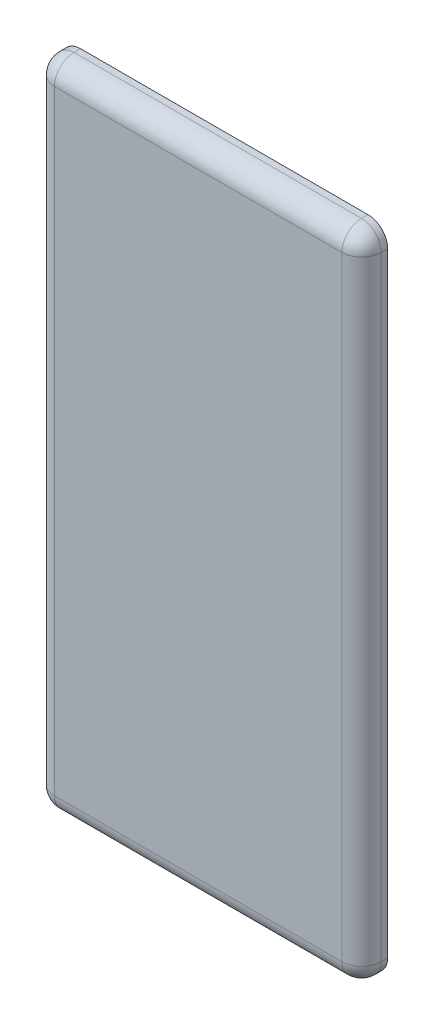
ISO-10303-21;
HEADER;
FILE_DESCRIPTION(('STEP AP214'),'2;1');
FILE_NAME('part.step','',(''),(''),'','','');
FILE_SCHEMA(('AUTOMOTIVE_DESIGN { 1 0 10303 214 1 1 1 1 }'));
ENDSEC;
DATA;
#1=APPLICATION_CONTEXT('core data for automotive mechanical design processes');
#2=APPLICATION_PROTOCOL_DEFINITION('international standard','automotive_design',2000,#1);
#3=PRODUCT_CONTEXT('',#1,'mechanical');
#4=PRODUCT('Part','Part','',(#3));
#5=PRODUCT_RELATED_PRODUCT_CATEGORY('part','',(#4));
#6=PRODUCT_DEFINITION_FORMATION('','',#4);
#7=PRODUCT_DEFINITION_CONTEXT('part definition',#1,'design');
#8=PRODUCT_DEFINITION('design','',#6,#7);
#9=PRODUCT_DEFINITION_SHAPE('','',#8);
#10=(LENGTH_UNIT() NAMED_UNIT(*) SI_UNIT(.MILLI.,.METRE.));
#11=(NAMED_UNIT(*) PLANE_ANGLE_UNIT() SI_UNIT($,.RADIAN.));
#12=(NAMED_UNIT(*) SI_UNIT($,.STERADIAN.) SOLID_ANGLE_UNIT());
#13=UNCERTAINTY_MEASURE_WITH_UNIT(LENGTH_MEASURE(1.E-05),#10,'distance_accuracy_value','');
#14=(GEOMETRIC_REPRESENTATION_CONTEXT(3) GLOBAL_UNCERTAINTY_ASSIGNED_CONTEXT((#13)) GLOBAL_UNIT_ASSIGNED_CONTEXT((#10,
#11,#12)) REPRESENTATION_CONTEXT('',''));
#15=CARTESIAN_POINT('',(0.,0.,0.));
#16=DIRECTION('',(0.,0.,1.));
#17=DIRECTION('',(1.,0.,0.));
#18=AXIS2_PLACEMENT_3D('',#15,#16,#17);
#19=CARTESIAN_POINT('',(25.,-50.,4.));
#20=DIRECTION('',(-1.,0.,0.));
#21=DIRECTION('',(0.,0.,1.));
#22=AXIS2_PLACEMENT_3D('',#19,#20,#21);
#23=PLANE('',#22);
#24=DIRECTION('',(0.,1.,0.));
#25=VECTOR('',#24,1.);
#26=CARTESIAN_POINT('',(25.,-50.,0.));
#27=LINE('',#26,#25);
#28=CARTESIAN_POINT('',(25.,-47.,0.));
#29=VERTEX_POINT('',#28);
#30=CARTESIAN_POINT('',(25.,47.,0.));
#31=VERTEX_POINT('',#30);
#32=EDGE_CURVE('E209',#29,#31,#27,.T.);
#33=ORIENTED_EDGE('',*,*,#32,.T.);
#34=DIRECTION('',(0.,0.,-1.));
#35=VECTOR('',#34,1.);
#36=CARTESIAN_POINT('',(25.,47.,4.));
#37=LINE('',#36,#35);
#38=CARTESIAN_POINT('',(25.,47.,1.));
#39=VERTEX_POINT('',#38);
#40=EDGE_CURVE('E200',#31,#39,#37,.F.);
#41=ORIENTED_EDGE('',*,*,#40,.T.);
#42=DIRECTION('',(0.,1.,0.));
#43=VECTOR('',#42,1.);
#44=CARTESIAN_POINT('',(25.,-50.,1.));
#45=LINE('',#44,#43);
#46=CARTESIAN_POINT('',(25.,-47.,1.));
#47=VERTEX_POINT('',#46);
#48=EDGE_CURVE('E173',#39,#47,#45,.F.);
#49=ORIENTED_EDGE('',*,*,#48,.T.);
#50=DIRECTION('',(0.,0.,-1.));
#51=VECTOR('',#50,1.);
#52=CARTESIAN_POINT('',(25.,-47.,4.));
#53=LINE('',#52,#51);
#54=EDGE_CURVE('E198',#47,#29,#53,.T.);
#55=ORIENTED_EDGE('',*,*,#54,.T.);
#56=EDGE_LOOP('',(#33,#41,#49,#55));
#57=FACE_BOUND('',#56,.T.);
#58=ADVANCED_FACE('F42',(#57),#23,.F.);
#59=CARTESIAN_POINT('',(-25.,50.,4.));
#60=DIRECTION('',(0.,-1.,0.));
#61=DIRECTION('',(0.,0.,-1.));
#62=AXIS2_PLACEMENT_3D('',#59,#60,#61);
#63=PLANE('',#62);
#64=DIRECTION('',(-1.,0.,0.));
#65=VECTOR('',#64,1.);
#66=CARTESIAN_POINT('',(-25.,50.,0.));
#67=LINE('',#66,#65);
#68=CARTESIAN_POINT('',(22.,50.,0.));
#69=VERTEX_POINT('',#68);
#70=CARTESIAN_POINT('',(-22.,50.,0.));
#71=VERTEX_POINT('',#70);
#72=EDGE_CURVE('E308',#69,#71,#67,.T.);
#73=ORIENTED_EDGE('',*,*,#72,.T.);
#74=DIRECTION('',(0.,0.,-1.));
#75=VECTOR('',#74,1.);
#76=CARTESIAN_POINT('',(-22.,50.,4.));
#77=LINE('',#76,#75);
#78=CARTESIAN_POINT('',(-22.,50.,1.));
#79=VERTEX_POINT('',#78);
#80=EDGE_CURVE('E196',#71,#79,#77,.F.);
#81=ORIENTED_EDGE('',*,*,#80,.T.);
#82=DIRECTION('',(-1.,0.,0.));
#83=VECTOR('',#82,1.);
#84=CARTESIAN_POINT('',(-25.,50.,1.));
#85=LINE('',#84,#83);
#86=CARTESIAN_POINT('',(22.,50.,1.));
#87=VERTEX_POINT('',#86);
#88=EDGE_CURVE('E171',#79,#87,#85,.F.);
#89=ORIENTED_EDGE('',*,*,#88,.T.);
#90=DIRECTION('',(0.,0.,-1.));
#91=VECTOR('',#90,1.);
#92=CARTESIAN_POINT('',(22.,50.,4.));
#93=LINE('',#92,#91);
#94=EDGE_CURVE('E65',#87,#69,#93,.T.);
#95=ORIENTED_EDGE('',*,*,#94,.T.);
#96=EDGE_LOOP('',(#73,#81,#89,#95));
#97=FACE_BOUND('',#96,.T.);
#98=ADVANCED_FACE('F236',(#97),#63,.F.);
#99=CARTESIAN_POINT('',(-25.,-50.,4.));
#100=DIRECTION('',(1.,0.,0.));
#101=DIRECTION('',(0.,0.,-1.));
#102=AXIS2_PLACEMENT_3D('',#99,#100,#101);
#103=PLANE('',#102);
#104=DIRECTION('',(0.,-1.,0.));
#105=VECTOR('',#104,1.);
#106=CARTESIAN_POINT('',(-25.,-50.,1.));
#107=LINE('',#106,#105);
#108=CARTESIAN_POINT('',(-25.,-47.,1.));
#109=VERTEX_POINT('',#108);
#110=CARTESIAN_POINT('',(-25.,47.,1.));
#111=VERTEX_POINT('',#110);
#112=EDGE_CURVE('E164',#109,#111,#107,.F.);
#113=ORIENTED_EDGE('',*,*,#112,.T.);
#114=DIRECTION('',(0.,0.,-1.));
#115=VECTOR('',#114,1.);
#116=CARTESIAN_POINT('',(-25.,47.,4.));
#117=LINE('',#116,#115);
#118=CARTESIAN_POINT('',(-25.,47.,0.));
#119=VERTEX_POINT('',#118);
#120=EDGE_CURVE('E186',#111,#119,#117,.T.);
#121=ORIENTED_EDGE('',*,*,#120,.T.);
#122=DIRECTION('',(0.,-1.,0.));
#123=VECTOR('',#122,1.);
#124=CARTESIAN_POINT('',(-25.,-50.,0.));
#125=LINE('',#124,#123);
#126=CARTESIAN_POINT('',(-25.,-47.,0.));
#127=VERTEX_POINT('',#126);
#128=EDGE_CURVE('E303',#119,#127,#125,.T.);
#129=ORIENTED_EDGE('',*,*,#128,.T.);
#130=DIRECTION('',(0.,0.,-1.));
#131=VECTOR('',#130,1.);
#132=CARTESIAN_POINT('',(-25.,-47.,4.));
#133=LINE('',#132,#131);
#134=EDGE_CURVE('E145',#127,#109,#133,.F.);
#135=ORIENTED_EDGE('',*,*,#134,.T.);
#136=EDGE_LOOP('',(#113,#121,#129,#135));
#137=FACE_BOUND('',#136,.T.);
#138=ADVANCED_FACE('F242',(#137),#103,.F.);
#139=CARTESIAN_POINT('',(-25.,-50.,4.));
#140=DIRECTION('',(0.,1.,0.));
#141=DIRECTION('',(0.,0.,1.));
#142=AXIS2_PLACEMENT_3D('',#139,#140,#141);
#143=PLANE('',#142);
#144=DIRECTION('',(1.,0.,0.));
#145=VECTOR('',#144,1.);
#146=CARTESIAN_POINT('',(-25.,-50.,0.));
#147=LINE('',#146,#145);
#148=CARTESIAN_POINT('',(-22.,-50.,0.));
#149=VERTEX_POINT('',#148);
#150=CARTESIAN_POINT('',(22.,-50.,0.));
#151=VERTEX_POINT('',#150);
#152=EDGE_CURVE('E157',#149,#151,#147,.T.);
#153=ORIENTED_EDGE('',*,*,#152,.T.);
#154=DIRECTION('',(0.,0.,-1.));
#155=VECTOR('',#154,1.);
#156=CARTESIAN_POINT('',(22.,-50.,4.));
#157=LINE('',#156,#155);
#158=CARTESIAN_POINT('',(22.,-50.,1.));
#159=VERTEX_POINT('',#158);
#160=EDGE_CURVE('E204',#151,#159,#157,.F.);
#161=ORIENTED_EDGE('',*,*,#160,.T.);
#162=DIRECTION('',(1.,0.,0.));
#163=VECTOR('',#162,1.);
#164=CARTESIAN_POINT('',(-25.,-50.,1.));
#165=LINE('',#164,#163);
#166=CARTESIAN_POINT('',(-22.,-50.,1.));
#167=VERTEX_POINT('',#166);
#168=EDGE_CURVE('E144',#159,#167,#165,.F.);
#169=ORIENTED_EDGE('',*,*,#168,.T.);
#170=DIRECTION('',(0.,0.,-1.));
#171=VECTOR('',#170,1.);
#172=CARTESIAN_POINT('',(-22.,-50.,4.));
#173=LINE('',#172,#171);
#174=EDGE_CURVE('E202',#167,#149,#173,.T.);
#175=ORIENTED_EDGE('',*,*,#174,.T.);
#176=EDGE_LOOP('',(#153,#161,#169,#175));
#177=FACE_BOUND('',#176,.T.);
#178=ADVANCED_FACE('F349',(#177),#143,.F.);
#179=CARTESIAN_POINT('',(0.,0.,4.));
#180=DIRECTION('',(0.,0.,-1.));
#181=DIRECTION('',(-1.,0.,0.));
#182=AXIS2_PLACEMENT_3D('',#179,#180,#181);
#183=PLANE('',#182);
#184=DIRECTION('',(0.,-1.,0.));
#185=VECTOR('',#184,1.);
#186=CARTESIAN_POINT('',(-22.,0.,4.));
#187=LINE('',#186,#185);
#188=CARTESIAN_POINT('',(-22.,47.,4.));
#189=VERTEX_POINT('',#188);
#190=CARTESIAN_POINT('',(-22.,-47.,4.));
#191=VERTEX_POINT('',#190);
#192=EDGE_CURVE('E162',#189,#191,#187,.T.);
#193=ORIENTED_EDGE('',*,*,#192,.T.);
#194=DIRECTION('',(1.,0.,0.));
#195=VECTOR('',#194,1.);
#196=CARTESIAN_POINT('',(0.,-47.,4.));
#197=LINE('',#196,#195);
#198=CARTESIAN_POINT('',(22.,-47.,4.));
#199=VERTEX_POINT('',#198);
#200=EDGE_CURVE('E141',#191,#199,#197,.T.);
#201=ORIENTED_EDGE('',*,*,#200,.T.);
#202=DIRECTION('',(0.,1.,0.));
#203=VECTOR('',#202,1.);
#204=CARTESIAN_POINT('',(22.,0.,4.));
#205=LINE('',#204,#203);
#206=CARTESIAN_POINT('',(22.,47.,4.));
#207=VERTEX_POINT('',#206);
#208=EDGE_CURVE('E150',#199,#207,#205,.T.);
#209=ORIENTED_EDGE('',*,*,#208,.T.);
#210=DIRECTION('',(-1.,0.,0.));
#211=VECTOR('',#210,1.);
#212=CARTESIAN_POINT('',(0.,47.,4.));
#213=LINE('',#212,#211);
#214=EDGE_CURVE('E156',#207,#189,#213,.T.);
#215=ORIENTED_EDGE('',*,*,#214,.T.);
#216=EDGE_LOOP('',(#193,#201,#209,#215));
#217=FACE_BOUND('',#216,.T.);
#218=ADVANCED_FACE('F160',(#217),#183,.F.);
#219=CARTESIAN_POINT('',(0.,0.,0.));
#220=DIRECTION('',(0.,0.,-1.));
#221=DIRECTION('',(-1.,0.,0.));
#222=AXIS2_PLACEMENT_3D('',#219,#220,#221);
#223=PLANE('',#222);
#224=CARTESIAN_POINT('',(0.,-25.,0.));
#225=DIRECTION('',(0.,0.,-1.));
#226=DIRECTION('',(-1.,0.,0.));
#227=AXIS2_PLACEMENT_3D('',#224,#225,#226);
#228=CIRCLE('',#227,4.75);
#229=CARTESIAN_POINT('',(-4.75000000000001,-25.,0.));
#230=VERTEX_POINT('',#229);
#231=EDGE_CURVE('E328',#230,#230,#228,.T.);
#232=ORIENTED_EDGE('',*,*,#231,.F.);
#233=EDGE_LOOP('',(#232));
#234=FACE_BOUND('',#233,.T.);
#235=CARTESIAN_POINT('',(0.,25.,0.));
#236=DIRECTION('',(0.,0.,-1.));
#237=DIRECTION('',(-1.,0.,0.));
#238=AXIS2_PLACEMENT_3D('',#235,#236,#237);
#239=CIRCLE('',#238,4.75);
#240=CARTESIAN_POINT('',(-4.75000000000001,25.,0.));
#241=VERTEX_POINT('',#240);
#242=EDGE_CURVE('E216',#241,#241,#239,.T.);
#243=ORIENTED_EDGE('',*,*,#242,.F.);
#244=EDGE_LOOP('',(#243));
#245=FACE_BOUND('',#244,.T.);
#246=ORIENTED_EDGE('',*,*,#128,.F.);
#247=CARTESIAN_POINT('',(-22.,47.,0.));
#248=DIRECTION('',(0.,0.,-1.));
#249=DIRECTION('',(-1.,0.,0.));
#250=AXIS2_PLACEMENT_3D('',#247,#248,#249);
#251=CIRCLE('',#250,3.);
#252=EDGE_CURVE('E58',#119,#71,#251,.T.);
#253=ORIENTED_EDGE('',*,*,#252,.T.);
#254=ORIENTED_EDGE('',*,*,#72,.F.);
#255=CARTESIAN_POINT('',(22.,47.,0.));
#256=DIRECTION('',(0.,0.,-1.));
#257=DIRECTION('',(-1.,0.,0.));
#258=AXIS2_PLACEMENT_3D('',#255,#256,#257);
#259=CIRCLE('',#258,3.);
#260=EDGE_CURVE('E192',#69,#31,#259,.T.);
#261=ORIENTED_EDGE('',*,*,#260,.T.);
#262=ORIENTED_EDGE('',*,*,#32,.F.);
#263=CARTESIAN_POINT('',(22.,-47.,0.));
#264=DIRECTION('',(0.,0.,-1.));
#265=DIRECTION('',(-1.,0.,0.));
#266=AXIS2_PLACEMENT_3D('',#263,#264,#265);
#267=CIRCLE('',#266,3.);
#268=EDGE_CURVE('E190',#29,#151,#267,.T.);
#269=ORIENTED_EDGE('',*,*,#268,.T.);
#270=ORIENTED_EDGE('',*,*,#152,.F.);
#271=CARTESIAN_POINT('',(-22.,-47.,0.));
#272=DIRECTION('',(0.,0.,-1.));
#273=DIRECTION('',(-1.,0.,0.));
#274=AXIS2_PLACEMENT_3D('',#271,#272,#273);
#275=CIRCLE('',#274,3.);
#276=EDGE_CURVE('E188',#149,#127,#275,.T.);
#277=ORIENTED_EDGE('',*,*,#276,.T.);
#278=EDGE_LOOP('',(#246,#253,#254,#261,#262,#269,#270,#277));
#279=FACE_BOUND('',#278,.T.);
#280=ADVANCED_FACE('F259',(#234,#245,#279),#223,.T.);
#281=CARTESIAN_POINT('',(0.,47.,1.));
#282=DIRECTION('',(-1.,0.,0.));
#283=DIRECTION('',(0.,0.,1.));
#284=AXIS2_PLACEMENT_3D('',#281,#282,#283);
#285=CYLINDRICAL_SURFACE('',#284,3.);
#286=ORIENTED_EDGE('',*,*,#88,.F.);
#287=CARTESIAN_POINT('',(-22.,47.,1.));
#288=DIRECTION('',(-1.,0.,0.));
#289=DIRECTION('',(0.,0.,1.));
#290=AXIS2_PLACEMENT_3D('',#287,#288,#289);
#291=CIRCLE('',#290,3.);
#292=EDGE_CURVE('E133',#79,#189,#291,.F.);
#293=ORIENTED_EDGE('',*,*,#292,.T.);
#294=ORIENTED_EDGE('',*,*,#214,.F.);
#295=CARTESIAN_POINT('',(22.,47.,1.));
#296=DIRECTION('',(-1.,0.,0.));
#297=DIRECTION('',(0.,0.,1.));
#298=AXIS2_PLACEMENT_3D('',#295,#296,#297);
#299=CIRCLE('',#298,3.);
#300=EDGE_CURVE('E180',#207,#87,#299,.T.);
#301=ORIENTED_EDGE('',*,*,#300,.T.);
#302=EDGE_LOOP('',(#286,#293,#294,#301));
#303=FACE_BOUND('',#302,.T.);
#304=ADVANCED_FACE('F255',(#303),#285,.T.);
#305=CARTESIAN_POINT('',(-22.,0.,1.));
#306=DIRECTION('',(0.,-1.,0.));
#307=DIRECTION('',(0.,0.,-1.));
#308=AXIS2_PLACEMENT_3D('',#305,#306,#307);
#309=CYLINDRICAL_SURFACE('',#308,3.);
#310=ORIENTED_EDGE('',*,*,#192,.F.);
#311=CARTESIAN_POINT('',(-22.,47.,1.));
#312=DIRECTION('',(0.,-1.,0.));
#313=DIRECTION('',(0.,0.,-1.));
#314=AXIS2_PLACEMENT_3D('',#311,#312,#313);
#315=CIRCLE('',#314,3.);
#316=EDGE_CURVE('E177',#189,#111,#315,.T.);
#317=ORIENTED_EDGE('',*,*,#316,.T.);
#318=ORIENTED_EDGE('',*,*,#112,.F.);
#319=CARTESIAN_POINT('',(-22.,-47.,1.));
#320=DIRECTION('',(0.,-1.,0.));
#321=DIRECTION('',(0.,0.,-1.));
#322=AXIS2_PLACEMENT_3D('',#319,#320,#321);
#323=CIRCLE('',#322,3.);
#324=EDGE_CURVE('E175',#109,#191,#323,.F.);
#325=ORIENTED_EDGE('',*,*,#324,.T.);
#326=EDGE_LOOP('',(#310,#317,#318,#325));
#327=FACE_BOUND('',#326,.T.);
#328=ADVANCED_FACE('F252',(#327),#309,.T.);
#329=CARTESIAN_POINT('',(22.,0.,1.));
#330=DIRECTION('',(0.,1.,0.));
#331=DIRECTION('',(0.,0.,1.));
#332=AXIS2_PLACEMENT_3D('',#329,#330,#331);
#333=CYLINDRICAL_SURFACE('',#332,3.);
#334=ORIENTED_EDGE('',*,*,#48,.F.);
#335=CARTESIAN_POINT('',(22.,47.,1.));
#336=DIRECTION('',(0.,1.,0.));
#337=DIRECTION('',(0.,0.,1.));
#338=AXIS2_PLACEMENT_3D('',#335,#336,#337);
#339=CIRCLE('',#338,3.);
#340=EDGE_CURVE('E132',#39,#207,#339,.F.);
#341=ORIENTED_EDGE('',*,*,#340,.T.);
#342=ORIENTED_EDGE('',*,*,#208,.F.);
#343=CARTESIAN_POINT('',(22.,-47.,1.));
#344=DIRECTION('',(0.,1.,0.));
#345=DIRECTION('',(0.,0.,1.));
#346=AXIS2_PLACEMENT_3D('',#343,#344,#345);
#347=CIRCLE('',#346,3.);
#348=EDGE_CURVE('E122',#199,#47,#347,.T.);
#349=ORIENTED_EDGE('',*,*,#348,.T.);
#350=EDGE_LOOP('',(#334,#341,#342,#349));
#351=FACE_BOUND('',#350,.T.);
#352=ADVANCED_FACE('F151',(#351),#333,.T.);
#353=CARTESIAN_POINT('',(0.,-47.,1.));
#354=DIRECTION('',(1.,0.,0.));
#355=DIRECTION('',(0.,0.,-1.));
#356=AXIS2_PLACEMENT_3D('',#353,#354,#355);
#357=CYLINDRICAL_SURFACE('',#356,3.);
#358=ORIENTED_EDGE('',*,*,#168,.F.);
#359=CARTESIAN_POINT('',(22.,-47.,1.));
#360=DIRECTION('',(1.,0.,0.));
#361=DIRECTION('',(0.,0.,-1.));
#362=AXIS2_PLACEMENT_3D('',#359,#360,#361);
#363=CIRCLE('',#362,3.);
#364=EDGE_CURVE('E125',#159,#199,#363,.F.);
#365=ORIENTED_EDGE('',*,*,#364,.T.);
#366=ORIENTED_EDGE('',*,*,#200,.F.);
#367=CARTESIAN_POINT('',(-22.,-47.,1.));
#368=DIRECTION('',(1.,0.,0.));
#369=DIRECTION('',(0.,0.,-1.));
#370=AXIS2_PLACEMENT_3D('',#367,#368,#369);
#371=CIRCLE('',#370,3.);
#372=EDGE_CURVE('E146',#191,#167,#371,.T.);
#373=ORIENTED_EDGE('',*,*,#372,.T.);
#374=EDGE_LOOP('',(#358,#365,#366,#373));
#375=FACE_BOUND('',#374,.T.);
#376=ADVANCED_FACE('F138',(#375),#357,.T.);
#377=CARTESIAN_POINT('',(-22.,47.,4.));
#378=DIRECTION('',(0.,0.,-1.));
#379=DIRECTION('',(-1.,0.,0.));
#380=AXIS2_PLACEMENT_3D('',#377,#378,#379);
#381=CYLINDRICAL_SURFACE('',#380,3.);
#382=ORIENTED_EDGE('',*,*,#252,.F.);
#383=ORIENTED_EDGE('',*,*,#120,.F.);
#384=CARTESIAN_POINT('',(-22.,47.,1.));
#385=DIRECTION('',(0.,0.,1.));
#386=DIRECTION('',(1.,0.,0.));
#387=AXIS2_PLACEMENT_3D('',#384,#385,#386);
#388=CIRCLE('',#387,3.);
#389=EDGE_CURVE('E207',#79,#111,#388,.T.);
#390=ORIENTED_EDGE('',*,*,#389,.F.);
#391=ORIENTED_EDGE('',*,*,#80,.F.);
#392=EDGE_LOOP('',(#382,#383,#390,#391));
#393=FACE_BOUND('',#392,.T.);
#394=ADVANCED_FACE('F249',(#393),#381,.T.);
#395=CARTESIAN_POINT('',(-22.,47.,1.));
#396=DIRECTION('',(0.,0.,1.));
#397=DIRECTION('',(1.,0.,0.));
#398=AXIS2_PLACEMENT_3D('',#395,#396,#397);
#399=SPHERICAL_SURFACE('',#398,3.);
#400=ORIENTED_EDGE('',*,*,#316,.F.);
#401=ORIENTED_EDGE('',*,*,#292,.F.);
#402=ORIENTED_EDGE('',*,*,#389,.T.);
#403=EDGE_LOOP('',(#400,#401,#402));
#404=FACE_BOUND('',#403,.T.);
#405=ADVANCED_FACE('F261',(#404),#399,.T.);
#406=CARTESIAN_POINT('',(22.,47.,4.));
#407=DIRECTION('',(0.,0.,-1.));
#408=DIRECTION('',(-1.,0.,0.));
#409=AXIS2_PLACEMENT_3D('',#406,#407,#408);
#410=CYLINDRICAL_SURFACE('',#409,3.);
#411=ORIENTED_EDGE('',*,*,#260,.F.);
#412=ORIENTED_EDGE('',*,*,#94,.F.);
#413=CARTESIAN_POINT('',(22.,47.,1.));
#414=DIRECTION('',(0.,0.,1.));
#415=DIRECTION('',(1.,0.,0.));
#416=AXIS2_PLACEMENT_3D('',#413,#414,#415);
#417=CIRCLE('',#416,3.);
#418=EDGE_CURVE('E210',#39,#87,#417,.T.);
#419=ORIENTED_EDGE('',*,*,#418,.F.);
#420=ORIENTED_EDGE('',*,*,#40,.F.);
#421=EDGE_LOOP('',(#411,#412,#419,#420));
#422=FACE_BOUND('',#421,.T.);
#423=ADVANCED_FACE('F264',(#422),#410,.T.);
#424=CARTESIAN_POINT('',(22.,47.,1.));
#425=DIRECTION('',(0.,0.,1.));
#426=DIRECTION('',(1.,0.,0.));
#427=AXIS2_PLACEMENT_3D('',#424,#425,#426);
#428=SPHERICAL_SURFACE('',#427,3.);
#429=ORIENTED_EDGE('',*,*,#418,.T.);
#430=ORIENTED_EDGE('',*,*,#300,.F.);
#431=ORIENTED_EDGE('',*,*,#340,.F.);
#432=EDGE_LOOP('',(#429,#430,#431));
#433=FACE_BOUND('',#432,.T.);
#434=ADVANCED_FACE('F269',(#433),#428,.T.);
#435=CARTESIAN_POINT('',(22.,-47.,4.));
#436=DIRECTION('',(0.,0.,-1.));
#437=DIRECTION('',(-1.,0.,0.));
#438=AXIS2_PLACEMENT_3D('',#435,#436,#437);
#439=CYLINDRICAL_SURFACE('',#438,3.);
#440=ORIENTED_EDGE('',*,*,#268,.F.);
#441=ORIENTED_EDGE('',*,*,#54,.F.);
#442=CARTESIAN_POINT('',(22.,-47.,1.));
#443=DIRECTION('',(0.,0.,1.));
#444=DIRECTION('',(1.,0.,0.));
#445=AXIS2_PLACEMENT_3D('',#442,#443,#444);
#446=CIRCLE('',#445,3.);
#447=EDGE_CURVE('E127',#159,#47,#446,.T.);
#448=ORIENTED_EDGE('',*,*,#447,.F.);
#449=ORIENTED_EDGE('',*,*,#160,.F.);
#450=EDGE_LOOP('',(#440,#441,#448,#449));
#451=FACE_BOUND('',#450,.T.);
#452=ADVANCED_FACE('F272',(#451),#439,.T.);
#453=CARTESIAN_POINT('',(22.,-47.,1.));
#454=DIRECTION('',(0.,0.,1.));
#455=DIRECTION('',(1.,0.,0.));
#456=AXIS2_PLACEMENT_3D('',#453,#454,#455);
#457=SPHERICAL_SURFACE('',#456,3.);
#458=ORIENTED_EDGE('',*,*,#447,.T.);
#459=ORIENTED_EDGE('',*,*,#348,.F.);
#460=ORIENTED_EDGE('',*,*,#364,.F.);
#461=EDGE_LOOP('',(#458,#459,#460));
#462=FACE_BOUND('',#461,.T.);
#463=ADVANCED_FACE('F124',(#462),#457,.T.);
#464=CARTESIAN_POINT('',(-22.,-47.,4.));
#465=DIRECTION('',(0.,0.,-1.));
#466=DIRECTION('',(-1.,0.,0.));
#467=AXIS2_PLACEMENT_3D('',#464,#465,#466);
#468=CYLINDRICAL_SURFACE('',#467,3.);
#469=ORIENTED_EDGE('',*,*,#276,.F.);
#470=ORIENTED_EDGE('',*,*,#174,.F.);
#471=CARTESIAN_POINT('',(-22.,-47.,1.));
#472=DIRECTION('',(0.,0.,1.));
#473=DIRECTION('',(1.,0.,0.));
#474=AXIS2_PLACEMENT_3D('',#471,#472,#473);
#475=CIRCLE('',#474,3.);
#476=EDGE_CURVE('E214',#109,#167,#475,.T.);
#477=ORIENTED_EDGE('',*,*,#476,.F.);
#478=ORIENTED_EDGE('',*,*,#134,.F.);
#479=EDGE_LOOP('',(#469,#470,#477,#478));
#480=FACE_BOUND('',#479,.T.);
#481=ADVANCED_FACE('F279',(#480),#468,.T.);
#482=CARTESIAN_POINT('',(-22.,-47.,1.));
#483=DIRECTION('',(0.,0.,1.));
#484=DIRECTION('',(1.,0.,0.));
#485=AXIS2_PLACEMENT_3D('',#482,#483,#484);
#486=SPHERICAL_SURFACE('',#485,3.);
#487=ORIENTED_EDGE('',*,*,#372,.F.);
#488=ORIENTED_EDGE('',*,*,#324,.F.);
#489=ORIENTED_EDGE('',*,*,#476,.T.);
#490=EDGE_LOOP('',(#487,#488,#489));
#491=FACE_BOUND('',#490,.T.);
#492=ADVANCED_FACE('F283',(#491),#486,.T.);
#493=CARTESIAN_POINT('',(0.,25.,-10.));
#494=DIRECTION('',(0.,0.,1.));
#495=DIRECTION('',(1.,0.,0.));
#496=AXIS2_PLACEMENT_3D('',#493,#494,#495);
#497=CYLINDRICAL_SURFACE('',#496,4.75);
#498=CARTESIAN_POINT('',(0.,25.,-6.99999999999997));
#499=DIRECTION('',(0.,0.,-1.));
#500=DIRECTION('',(-1.,0.,0.));
#501=AXIS2_PLACEMENT_3D('',#498,#499,#500);
#502=CIRCLE('',#501,4.75);
#503=CARTESIAN_POINT('',(4.74999999999999,25.,-6.99999999999997));
#504=VERTEX_POINT('',#503);
#505=EDGE_CURVE('E11',#504,#504,#502,.F.);
#506=ORIENTED_EDGE('',*,*,#505,.T.);
#507=EDGE_LOOP('',(#506));
#508=FACE_BOUND('',#507,.T.);
#509=ORIENTED_EDGE('',*,*,#242,.T.);
#510=EDGE_LOOP('',(#509));
#511=FACE_BOUND('',#510,.T.);
#512=ADVANCED_FACE('F286',(#508,#511),#497,.T.);
#513=CARTESIAN_POINT('',(0.,25.,-10.));
#514=DIRECTION('',(0.,0.,-1.));
#515=DIRECTION('',(-1.,0.,0.));
#516=AXIS2_PLACEMENT_3D('',#513,#514,#515);
#517=PLANE('',#516);
#518=CARTESIAN_POINT('',(0.,25.,-10.));
#519=DIRECTION('',(0.,0.,-1.));
#520=DIRECTION('',(-1.,0.,0.));
#521=AXIS2_PLACEMENT_3D('',#518,#519,#520);
#522=CIRCLE('',#521,3.53792132249452);
#523=CARTESIAN_POINT('',(3.53792132249452,25.,-10.));
#524=VERTEX_POINT('',#523);
#525=EDGE_CURVE('E51',#524,#524,#522,.T.);
#526=ORIENTED_EDGE('',*,*,#525,.T.);
#527=EDGE_LOOP('',(#526));
#528=FACE_BOUND('',#527,.T.);
#529=ADVANCED_FACE('F224',(#528),#517,.T.);
#530=CARTESIAN_POINT('',(0.,-25.,-10.));
#531=DIRECTION('',(0.,0.,1.));
#532=DIRECTION('',(1.,0.,0.));
#533=AXIS2_PLACEMENT_3D('',#530,#531,#532);
#534=CYLINDRICAL_SURFACE('',#533,4.75);
#535=CARTESIAN_POINT('',(0.,-25.,-6.99999999999997));
#536=DIRECTION('',(0.,0.,-1.));
#537=DIRECTION('',(-1.,0.,0.));
#538=AXIS2_PLACEMENT_3D('',#535,#536,#537);
#539=CIRCLE('',#538,4.75);
#540=CARTESIAN_POINT('',(4.74999999999999,-25.,-6.99999999999997));
#541=VERTEX_POINT('',#540);
#542=EDGE_CURVE('E219',#541,#541,#539,.F.);
#543=ORIENTED_EDGE('',*,*,#542,.T.);
#544=EDGE_LOOP('',(#543));
#545=FACE_BOUND('',#544,.T.);
#546=ORIENTED_EDGE('',*,*,#231,.T.);
#547=EDGE_LOOP('',(#546));
#548=FACE_BOUND('',#547,.T.);
#549=ADVANCED_FACE('F332',(#545,#548),#534,.T.);
#550=CARTESIAN_POINT('',(0.,-25.,-10.));
#551=DIRECTION('',(0.,0.,-1.));
#552=DIRECTION('',(-1.,0.,0.));
#553=AXIS2_PLACEMENT_3D('',#550,#551,#552);
#554=PLANE('',#553);
#555=CARTESIAN_POINT('',(0.,-25.,-10.));
#556=DIRECTION('',(0.,0.,-1.));
#557=DIRECTION('',(-1.,0.,0.));
#558=AXIS2_PLACEMENT_3D('',#555,#556,#557);
#559=CIRCLE('',#558,3.53792132249452);
#560=CARTESIAN_POINT('',(3.53792132249452,-25.,-10.));
#561=VERTEX_POINT('',#560);
#562=EDGE_CURVE('E206',#561,#561,#559,.T.);
#563=ORIENTED_EDGE('',*,*,#562,.T.);
#564=EDGE_LOOP('',(#563));
#565=FACE_BOUND('',#564,.T.);
#566=ADVANCED_FACE('F232',(#565),#554,.T.);
#567=CARTESIAN_POINT('',(0.,-25.,-10.));
#568=DIRECTION('',(0.,0.,1.));
#569=DIRECTION('',(1.,0.,0.));
#570=AXIS2_PLACEMENT_3D('',#567,#568,#569);
#571=CONICAL_SURFACE('',#570,3.53792132249452,0.38397243543875);
#572=CARTESIAN_POINT('',(4.74999999999999,-25.,-6.99999999999997));
#573=CARTESIAN_POINT('',(4.73737418044265,-25.,-7.03124999999997));
#574=CARTESIAN_POINT('',(4.7247483608853,-25.,-7.06249999999997));
#575=CARTESIAN_POINT('',(4.6994967217706,-25.,-7.12499999999997));
#576=CARTESIAN_POINT('',(4.68687090221325,-25.,-7.15624999999997));
#577=CARTESIAN_POINT('',(4.66161926309855,-25.,-7.21874999999997));
#578=CARTESIAN_POINT('',(4.64899344354121,-25.,-7.24999999999997));
#579=CARTESIAN_POINT('',(4.62374180442651,-25.,-7.31249999999997));
#580=CARTESIAN_POINT('',(4.61111598486916,-25.,-7.34374999999997));
#581=CARTESIAN_POINT('',(4.58586434575446,-25.,-7.40624999999997));
#582=CARTESIAN_POINT('',(4.57323852619711,-25.,-7.43749999999997));
#583=CARTESIAN_POINT('',(4.54798688708242,-25.,-7.49999999999997));
#584=CARTESIAN_POINT('',(4.53536106752507,-25.,-7.53124999999997));
#585=CARTESIAN_POINT('',(4.51010942841037,-25.,-7.59374999999997));
#586=CARTESIAN_POINT('',(4.49748360885302,-25.,-7.62499999999997));
#587=CARTESIAN_POINT('',(4.47223196973832,-25.,-7.68749999999998));
#588=CARTESIAN_POINT('',(4.45960615018098,-25.,-7.71874999999998));
#589=CARTESIAN_POINT('',(4.43435451106628,-25.,-7.78124999999998));
#590=CARTESIAN_POINT('',(4.42172869150893,-25.,-7.81249999999998));
#591=CARTESIAN_POINT('',(4.39647705239423,-25.,-7.87499999999998));
#592=CARTESIAN_POINT('',(4.38385123283688,-25.,-7.90624999999998));
#593=CARTESIAN_POINT('',(4.35859959372218,-25.,-7.96874999999998));
#594=CARTESIAN_POINT('',(4.34597377416484,-25.,-7.99999999999998));
#595=CARTESIAN_POINT('',(4.32072213505014,-25.,-8.06249999999998));
#596=CARTESIAN_POINT('',(4.30809631549279,-25.,-8.09374999999998));
#597=CARTESIAN_POINT('',(4.28284467637809,-25.,-8.15624999999998));
#598=CARTESIAN_POINT('',(4.27021885682074,-25.,-8.18749999999998));
#599=CARTESIAN_POINT('',(4.24496721770605,-25.,-8.24999999999998));
#600=CARTESIAN_POINT('',(4.2323413981487,-25.,-8.28124999999998));
#601=CARTESIAN_POINT('',(4.207089759034,-25.,-8.34374999999998));
#602=CARTESIAN_POINT('',(4.19446393947665,-25.,-8.37499999999998));
#603=CARTESIAN_POINT('',(4.16921230036195,-25.,-8.43749999999998));
#604=CARTESIAN_POINT('',(4.15658648080461,-25.,-8.46874999999998));
#605=CARTESIAN_POINT('',(4.13133484168991,-25.,-8.53124999999998));
#606=CARTESIAN_POINT('',(4.11870902213256,-25.,-8.56249999999999));
#607=CARTESIAN_POINT('',(4.09345738301786,-25.,-8.62499999999999));
#608=CARTESIAN_POINT('',(4.08083156346051,-25.,-8.65624999999999));
#609=CARTESIAN_POINT('',(4.05557992434582,-25.,-8.71874999999999));
#610=CARTESIAN_POINT('',(4.04295410478847,-25.,-8.74999999999999));
#611=CARTESIAN_POINT('',(4.01770246567377,-25.,-8.81249999999999));
#612=CARTESIAN_POINT('',(4.00507664611642,-25.,-8.84374999999999));
#613=CARTESIAN_POINT('',(3.97982500700172,-25.,-8.90624999999999));
#614=CARTESIAN_POINT('',(3.96719918744437,-25.,-8.93749999999999));
#615=CARTESIAN_POINT('',(3.94194754832968,-25.,-8.99999999999999));
#616=CARTESIAN_POINT('',(3.92932172877233,-25.,-9.03124999999999));
#617=CARTESIAN_POINT('',(3.90407008965763,-25.,-9.09374999999999));
#618=CARTESIAN_POINT('',(3.89144427010028,-25.,-9.12499999999999));
#619=CARTESIAN_POINT('',(3.86619263098559,-25.,-9.18749999999999));
#620=CARTESIAN_POINT('',(3.85356681142824,-25.,-9.21874999999999));
#621=CARTESIAN_POINT('',(3.82831517231354,-25.,-9.28124999999999));
#622=CARTESIAN_POINT('',(3.81568935275619,-25.,-9.31249999999999));
#623=CARTESIAN_POINT('',(3.79043771364149,-25.,-9.37499999999999));
#624=CARTESIAN_POINT('',(3.77781189408414,-25.,-9.40624999999999));
#625=CARTESIAN_POINT('',(3.75256025496945,-25.,-9.46874999999999));
#626=CARTESIAN_POINT('',(3.7399344354121,-25.,-9.49999999999999));
#627=CARTESIAN_POINT('',(3.7146827962974,-25.,-9.56249999999999));
#628=CARTESIAN_POINT('',(3.70205697674005,-25.,-9.59375));
#629=CARTESIAN_POINT('',(3.67680533762535,-25.,-9.65625));
#630=CARTESIAN_POINT('',(3.66417951806801,-25.,-9.6875));
#631=CARTESIAN_POINT('',(3.63892787895331,-25.,-9.75));
#632=CARTESIAN_POINT('',(3.62630205939596,-25.,-9.78125));
#633=CARTESIAN_POINT('',(3.60105042028126,-25.,-9.84375));
#634=CARTESIAN_POINT('',(3.58842460072391,-25.,-9.875));
#635=CARTESIAN_POINT('',(3.56317296160922,-25.,-9.9375));
#636=CARTESIAN_POINT('',(3.55054714205187,-25.,-9.96875));
#637=CARTESIAN_POINT('',(3.53792132249452,-25.,-10.));
#638=B_SPLINE_CURVE_WITH_KNOTS('',3,(#572,#573,#574,#575,#576,#577,#578,#579,#580,#581,#582,
#583,#584,#585,#586,#587,#588,#589,#590,#591,#592,#593,#594,#595,#596,#597,#598,#599,#600,#601,
#602,#603,#604,#605,#606,#607,#608,#609,#610,#611,#612,#613,#614,#615,#616,#617,#618,#619,#620,
#621,#622,#623,#624,#625,#626,#627,#628,#629,#630,#631,#632,#633,#634,#635,#636,#637),
.UNSPECIFIED.,.F.,.F.,(4,2,2,2,2,2,2,2,2,2,2,2,2,2,2,2,2,2,2,2,2,2,2,2,2,2,2,2,2,2,2,2,4),(0.,
0.101112632126024,0.202225264252049,0.303337896378072,0.404450528504097,0.505563160630122,
0.606675792756146,0.707788424882171,0.808901057008195,0.910013689134219,1.01112632126024,
1.11223895338627,1.21335158551229,1.31446421763832,1.41557684976434,1.51668948189037,
1.61780211401639,1.71891474614242,1.82002737826844,1.92114001039446,2.02225264252049,
2.12336527464651,2.22447790677254,2.32559053889856,2.42670317102459,2.52781580315061,
2.62892843527663,2.73004106740266,2.83115369952868,2.93226633165471,3.03337896378073,
3.13449159590676,3.23560422803278),.UNSPECIFIED.);
#639=EDGE_CURVE('BSEAM227',#541,#561,#638,.T.);
#640=ORIENTED_EDGE('',*,*,#542,.F.);
#641=ORIENTED_EDGE('',*,*,#562,.F.);
#642=ORIENTED_EDGE('',*,*,#639,.T.);
#643=ORIENTED_EDGE('',*,*,#639,.F.);
#644=EDGE_LOOP('',(#640,#642,#641,#643));
#645=FACE_BOUND('',#644,.T.);
#646=ADVANCED_FACE('F227',(#645),#571,.T.);
#647=CARTESIAN_POINT('',(0.,25.,-10.));
#648=DIRECTION('',(0.,0.,1.));
#649=DIRECTION('',(1.,0.,0.));
#650=AXIS2_PLACEMENT_3D('',#647,#648,#649);
#651=CONICAL_SURFACE('',#650,3.53792132249452,0.38397243543875);
#652=CARTESIAN_POINT('',(4.74999999999999,25.,-6.99999999999997));
#653=CARTESIAN_POINT('',(4.73737418044265,25.,-7.03124999999997));
#654=CARTESIAN_POINT('',(4.7247483608853,25.,-7.06249999999997));
#655=CARTESIAN_POINT('',(4.6994967217706,25.,-7.12499999999997));
#656=CARTESIAN_POINT('',(4.68687090221325,25.,-7.15624999999997));
#657=CARTESIAN_POINT('',(4.66161926309855,25.,-7.21874999999997));
#658=CARTESIAN_POINT('',(4.64899344354121,25.,-7.24999999999997));
#659=CARTESIAN_POINT('',(4.62374180442651,25.,-7.31249999999997));
#660=CARTESIAN_POINT('',(4.61111598486916,25.,-7.34374999999997));
#661=CARTESIAN_POINT('',(4.58586434575446,25.,-7.40624999999997));
#662=CARTESIAN_POINT('',(4.57323852619711,25.,-7.43749999999997));
#663=CARTESIAN_POINT('',(4.54798688708242,25.,-7.49999999999997));
#664=CARTESIAN_POINT('',(4.53536106752507,25.,-7.53124999999997));
#665=CARTESIAN_POINT('',(4.51010942841037,25.,-7.59374999999997));
#666=CARTESIAN_POINT('',(4.49748360885302,25.,-7.62499999999997));
#667=CARTESIAN_POINT('',(4.47223196973832,25.,-7.68749999999998));
#668=CARTESIAN_POINT('',(4.45960615018098,25.,-7.71874999999998));
#669=CARTESIAN_POINT('',(4.43435451106628,25.,-7.78124999999998));
#670=CARTESIAN_POINT('',(4.42172869150893,25.,-7.81249999999998));
#671=CARTESIAN_POINT('',(4.39647705239423,25.,-7.87499999999998));
#672=CARTESIAN_POINT('',(4.38385123283688,25.,-7.90624999999998));
#673=CARTESIAN_POINT('',(4.35859959372218,25.,-7.96874999999998));
#674=CARTESIAN_POINT('',(4.34597377416484,25.,-7.99999999999998));
#675=CARTESIAN_POINT('',(4.32072213505014,25.,-8.06249999999998));
#676=CARTESIAN_POINT('',(4.30809631549279,25.,-8.09374999999998));
#677=CARTESIAN_POINT('',(4.28284467637809,25.,-8.15624999999998));
#678=CARTESIAN_POINT('',(4.27021885682074,25.,-8.18749999999998));
#679=CARTESIAN_POINT('',(4.24496721770605,25.,-8.24999999999998));
#680=CARTESIAN_POINT('',(4.2323413981487,25.,-8.28124999999998));
#681=CARTESIAN_POINT('',(4.207089759034,25.,-8.34374999999998));
#682=CARTESIAN_POINT('',(4.19446393947665,25.,-8.37499999999998));
#683=CARTESIAN_POINT('',(4.16921230036195,25.,-8.43749999999998));
#684=CARTESIAN_POINT('',(4.15658648080461,25.,-8.46874999999998));
#685=CARTESIAN_POINT('',(4.13133484168991,25.,-8.53124999999998));
#686=CARTESIAN_POINT('',(4.11870902213256,25.,-8.56249999999999));
#687=CARTESIAN_POINT('',(4.09345738301786,25.,-8.62499999999999));
#688=CARTESIAN_POINT('',(4.08083156346051,25.,-8.65624999999999));
#689=CARTESIAN_POINT('',(4.05557992434582,25.,-8.71874999999999));
#690=CARTESIAN_POINT('',(4.04295410478847,25.,-8.74999999999999));
#691=CARTESIAN_POINT('',(4.01770246567377,25.,-8.81249999999999));
#692=CARTESIAN_POINT('',(4.00507664611642,25.,-8.84374999999999));
#693=CARTESIAN_POINT('',(3.97982500700172,25.,-8.90624999999999));
#694=CARTESIAN_POINT('',(3.96719918744437,25.,-8.93749999999999));
#695=CARTESIAN_POINT('',(3.94194754832968,25.,-8.99999999999999));
#696=CARTESIAN_POINT('',(3.92932172877233,25.,-9.03124999999999));
#697=CARTESIAN_POINT('',(3.90407008965763,25.,-9.09374999999999));
#698=CARTESIAN_POINT('',(3.89144427010028,25.,-9.12499999999999));
#699=CARTESIAN_POINT('',(3.86619263098559,25.,-9.18749999999999));
#700=CARTESIAN_POINT('',(3.85356681142824,25.,-9.21874999999999));
#701=CARTESIAN_POINT('',(3.82831517231354,25.,-9.28124999999999));
#702=CARTESIAN_POINT('',(3.81568935275619,25.,-9.31249999999999));
#703=CARTESIAN_POINT('',(3.79043771364149,25.,-9.37499999999999));
#704=CARTESIAN_POINT('',(3.77781189408414,25.,-9.40624999999999));
#705=CARTESIAN_POINT('',(3.75256025496945,25.,-9.46874999999999));
#706=CARTESIAN_POINT('',(3.7399344354121,25.,-9.49999999999999));
#707=CARTESIAN_POINT('',(3.7146827962974,25.,-9.56249999999999));
#708=CARTESIAN_POINT('',(3.70205697674005,25.,-9.59375));
#709=CARTESIAN_POINT('',(3.67680533762535,25.,-9.65625));
#710=CARTESIAN_POINT('',(3.66417951806801,25.,-9.6875));
#711=CARTESIAN_POINT('',(3.63892787895331,25.,-9.75));
#712=CARTESIAN_POINT('',(3.62630205939596,25.,-9.78125));
#713=CARTESIAN_POINT('',(3.60105042028126,25.,-9.84375));
#714=CARTESIAN_POINT('',(3.58842460072391,25.,-9.875));
#715=CARTESIAN_POINT('',(3.56317296160922,25.,-9.9375));
#716=CARTESIAN_POINT('',(3.55054714205187,25.,-9.96875));
#717=CARTESIAN_POINT('',(3.53792132249452,25.,-10.));
#718=B_SPLINE_CURVE_WITH_KNOTS('',3,(#652,#653,#654,#655,#656,#657,#658,#659,#660,#661,#662,
#663,#664,#665,#666,#667,#668,#669,#670,#671,#672,#673,#674,#675,#676,#677,#678,#679,#680,#681,
#682,#683,#684,#685,#686,#687,#688,#689,#690,#691,#692,#693,#694,#695,#696,#697,#698,#699,#700,
#701,#702,#703,#704,#705,#706,#707,#708,#709,#710,#711,#712,#713,#714,#715,#716,#717),
.UNSPECIFIED.,.F.,.F.,(4,2,2,2,2,2,2,2,2,2,2,2,2,2,2,2,2,2,2,2,2,2,2,2,2,2,2,2,2,2,2,2,4),(0.,
0.101112632126024,0.202225264252049,0.303337896378072,0.404450528504097,0.505563160630122,
0.606675792756146,0.707788424882171,0.808901057008195,0.910013689134219,1.01112632126024,
1.11223895338627,1.21335158551229,1.31446421763832,1.41557684976434,1.51668948189037,
1.61780211401639,1.71891474614242,1.82002737826844,1.92114001039446,2.02225264252049,
2.12336527464651,2.22447790677254,2.32559053889856,2.42670317102459,2.52781580315061,
2.62892843527663,2.73004106740266,2.83115369952868,2.93226633165471,3.03337896378073,
3.13449159590676,3.23560422803278),.UNSPECIFIED.);
#719=EDGE_CURVE('BSEAM45',#504,#524,#718,.T.);
#720=ORIENTED_EDGE('',*,*,#505,.F.);
#721=ORIENTED_EDGE('',*,*,#525,.F.);
#722=ORIENTED_EDGE('',*,*,#719,.T.);
#723=ORIENTED_EDGE('',*,*,#719,.F.);
#724=EDGE_LOOP('',(#720,#722,#721,#723));
#725=FACE_BOUND('',#724,.T.);
#726=ADVANCED_FACE('F45',(#725),#651,.T.);
#727=CLOSED_SHELL('',(#58,#98,#138,#178,#218,#280,#304,#328,#352,#376,#394,#405,#423,#434,#452,
#463,#481,#492,#512,#529,#549,#566,#646,#726));
#728=MANIFOLD_SOLID_BREP('B2',#727);
#729=ADVANCED_BREP_SHAPE_REPRESENTATION('',(#18,#728),#14);
#730=SHAPE_DEFINITION_REPRESENTATION(#9,#729);
ENDSEC;
END-ISO-10303-21;
